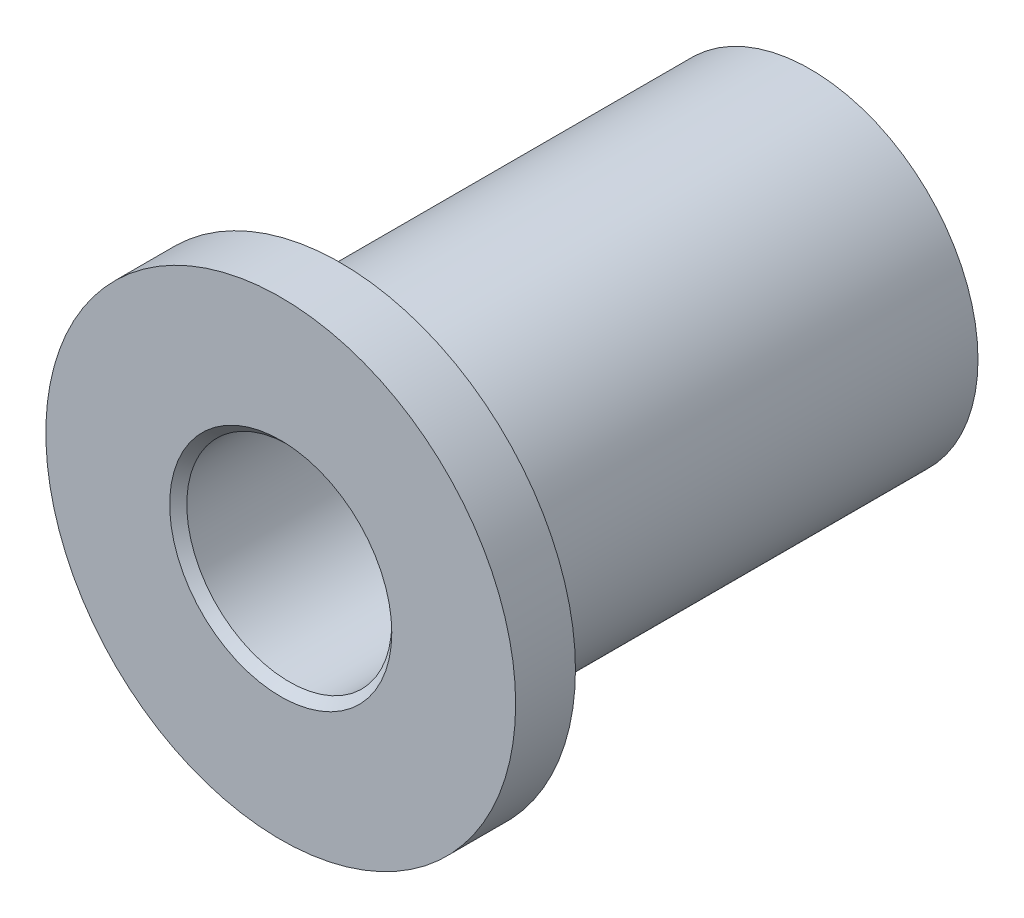
ISO-10303-21;
HEADER;
FILE_DESCRIPTION(('STEP AP214'),'2;1');
FILE_NAME('part.step','',(''),(''),'','','');
FILE_SCHEMA(('AUTOMOTIVE_DESIGN { 1 0 10303 214 1 1 1 1 }'));
ENDSEC;
DATA;
#1=APPLICATION_CONTEXT('core data for automotive mechanical design processes');
#2=APPLICATION_PROTOCOL_DEFINITION('international standard','automotive_design',2000,#1);
#3=PRODUCT_CONTEXT('',#1,'mechanical');
#4=PRODUCT('Part','Part','',(#3));
#5=PRODUCT_RELATED_PRODUCT_CATEGORY('part','',(#4));
#6=PRODUCT_DEFINITION_FORMATION('','',#4);
#7=PRODUCT_DEFINITION_CONTEXT('part definition',#1,'design');
#8=PRODUCT_DEFINITION('design','',#6,#7);
#9=PRODUCT_DEFINITION_SHAPE('','',#8);
#10=(LENGTH_UNIT() NAMED_UNIT(*) SI_UNIT(.MILLI.,.METRE.));
#11=(NAMED_UNIT(*) PLANE_ANGLE_UNIT() SI_UNIT($,.RADIAN.));
#12=(NAMED_UNIT(*) SI_UNIT($,.STERADIAN.) SOLID_ANGLE_UNIT());
#13=UNCERTAINTY_MEASURE_WITH_UNIT(LENGTH_MEASURE(1.E-05),#10,'distance_accuracy_value','');
#14=(GEOMETRIC_REPRESENTATION_CONTEXT(3) GLOBAL_UNCERTAINTY_ASSIGNED_CONTEXT((#13)) GLOBAL_UNIT_ASSIGNED_CONTEXT((#10,
#11,#12)) REPRESENTATION_CONTEXT('',''));
#15=CARTESIAN_POINT('',(0.,0.,0.));
#16=DIRECTION('',(0.,0.,1.));
#17=DIRECTION('',(1.,0.,0.));
#18=AXIS2_PLACEMENT_3D('',#15,#16,#17);
#19=CARTESIAN_POINT('',(0.,0.,-1.4));
#20=DIRECTION('',(0.,0.,1.));
#21=DIRECTION('',(1.,0.,0.));
#22=AXIS2_PLACEMENT_3D('',#19,#20,#21);
#23=PLANE('',#22);
#24=CARTESIAN_POINT('',(0.,0.,-1.4));
#25=DIRECTION('',(0.,0.,1.));
#26=DIRECTION('',(1.,0.,0.));
#27=AXIS2_PLACEMENT_3D('',#24,#25,#26);
#28=CIRCLE('',#27,5.5);
#29=CARTESIAN_POINT('',(5.5,0.,-1.4));
#30=VERTEX_POINT('',#29);
#31=EDGE_CURVE('E45',#30,#30,#28,.T.);
#32=ORIENTED_EDGE('',*,*,#31,.F.);
#33=EDGE_LOOP('',(#32));
#34=FACE_BOUND('',#33,.T.);
#35=CARTESIAN_POINT('',(0.,0.,-1.4));
#36=DIRECTION('',(0.,0.,1.));
#37=DIRECTION('',(1.,0.,0.));
#38=AXIS2_PLACEMENT_3D('',#35,#36,#37);
#39=CIRCLE('',#38,3.925);
#40=CARTESIAN_POINT('',(3.925,0.,-1.4));
#41=VERTEX_POINT('',#40);
#42=EDGE_CURVE('E41',#41,#41,#39,.F.);
#43=ORIENTED_EDGE('',*,*,#42,.F.);
#44=EDGE_LOOP('',(#43));
#45=FACE_BOUND('',#44,.T.);
#46=ADVANCED_FACE('F30',(#34,#45),#23,.F.);
#47=CARTESIAN_POINT('',(0.,0.,-1.4));
#48=DIRECTION('',(0.,0.,1.));
#49=DIRECTION('',(1.,0.,0.));
#50=AXIS2_PLACEMENT_3D('',#47,#48,#49);
#51=CYLINDRICAL_SURFACE('',#50,5.5);
#52=ORIENTED_EDGE('',*,*,#31,.T.);
#53=EDGE_LOOP('',(#52));
#54=FACE_BOUND('',#53,.T.);
#55=CARTESIAN_POINT('',(0.,0.,0.));
#56=DIRECTION('',(0.,0.,1.));
#57=DIRECTION('',(1.,0.,0.));
#58=AXIS2_PLACEMENT_3D('',#55,#56,#57);
#59=CIRCLE('',#58,5.5);
#60=CARTESIAN_POINT('',(5.5,0.,0.));
#61=VERTEX_POINT('',#60);
#62=EDGE_CURVE('E48',#61,#61,#59,.T.);
#63=ORIENTED_EDGE('',*,*,#62,.F.);
#64=EDGE_LOOP('',(#63));
#65=FACE_BOUND('',#64,.T.);
#66=ADVANCED_FACE('F74',(#54,#65),#51,.T.);
#67=CARTESIAN_POINT('',(0.,0.,0.));
#68=DIRECTION('',(0.,0.,1.));
#69=DIRECTION('',(1.,0.,0.));
#70=AXIS2_PLACEMENT_3D('',#67,#68,#69);
#71=PLANE('',#70);
#72=CARTESIAN_POINT('',(0.,0.,0.));
#73=DIRECTION('',(0.,0.,1.));
#74=DIRECTION('',(1.,0.,0.));
#75=AXIS2_PLACEMENT_3D('',#72,#73,#74);
#76=CIRCLE('',#75,2.60000000000001);
#77=CARTESIAN_POINT('',(2.60000000000001,0.,0.));
#78=VERTEX_POINT('',#77);
#79=EDGE_CURVE('E10',#78,#78,#76,.F.);
#80=ORIENTED_EDGE('',*,*,#79,.T.);
#81=EDGE_LOOP('',(#80));
#82=FACE_BOUND('',#81,.T.);
#83=ORIENTED_EDGE('',*,*,#62,.T.);
#84=EDGE_LOOP('',(#83));
#85=FACE_BOUND('',#84,.T.);
#86=ADVANCED_FACE('F80',(#82,#85),#71,.T.);
#87=CARTESIAN_POINT('',(0.,0.,-12.4));
#88=DIRECTION('',(0.,0.,1.));
#89=DIRECTION('',(1.,0.,0.));
#90=AXIS2_PLACEMENT_3D('',#87,#88,#89);
#91=CYLINDRICAL_SURFACE('',#90,3.925);
#92=CARTESIAN_POINT('',(0.,0.,-12.4));
#93=DIRECTION('',(0.,0.,-1.));
#94=DIRECTION('',(-1.,0.,0.));
#95=AXIS2_PLACEMENT_3D('',#92,#93,#94);
#96=CIRCLE('',#95,3.925);
#97=CARTESIAN_POINT('',(-3.925,0.,-12.4));
#98=VERTEX_POINT('',#97);
#99=EDGE_CURVE('E51',#98,#98,#96,.T.);
#100=ORIENTED_EDGE('',*,*,#99,.F.);
#101=EDGE_LOOP('',(#100));
#102=FACE_BOUND('',#101,.T.);
#103=ORIENTED_EDGE('',*,*,#42,.T.);
#104=EDGE_LOOP('',(#103));
#105=FACE_BOUND('',#104,.T.);
#106=ADVANCED_FACE('F71',(#102,#105),#91,.T.);
#107=CARTESIAN_POINT('',(0.,0.,-12.4));
#108=DIRECTION('',(0.,0.,-1.));
#109=DIRECTION('',(-1.,0.,0.));
#110=AXIS2_PLACEMENT_3D('',#107,#108,#109);
#111=PLANE('',#110);
#112=CARTESIAN_POINT('',(0.,0.,-12.4));
#113=DIRECTION('',(0.,0.,1.));
#114=DIRECTION('',(1.,0.,0.));
#115=AXIS2_PLACEMENT_3D('',#112,#113,#114);
#116=CIRCLE('',#115,2.4);
#117=CARTESIAN_POINT('',(2.4,0.,-12.4));
#118=VERTEX_POINT('',#117);
#119=EDGE_CURVE('E56',#118,#118,#116,.T.);
#120=ORIENTED_EDGE('',*,*,#119,.T.);
#121=EDGE_LOOP('',(#120));
#122=FACE_BOUND('',#121,.T.);
#123=ORIENTED_EDGE('',*,*,#99,.T.);
#124=EDGE_LOOP('',(#123));
#125=FACE_BOUND('',#124,.T.);
#126=ADVANCED_FACE('F60',(#122,#125),#111,.T.);
#127=CARTESIAN_POINT('',(0.,0.,-12.4));
#128=DIRECTION('',(0.,0.,1.));
#129=DIRECTION('',(1.,0.,0.));
#130=AXIS2_PLACEMENT_3D('',#127,#128,#129);
#131=CYLINDRICAL_SURFACE('',#130,2.4);
#132=CARTESIAN_POINT('',(0.,0.,-0.200000000000013));
#133=DIRECTION('',(0.,0.,1.));
#134=DIRECTION('',(1.,0.,0.));
#135=AXIS2_PLACEMENT_3D('',#132,#133,#134);
#136=CIRCLE('',#135,2.4);
#137=CARTESIAN_POINT('',(2.4,0.,-0.200000000000013));
#138=VERTEX_POINT('',#137);
#139=EDGE_CURVE('E37',#138,#138,#136,.T.);
#140=CARTESIAN_POINT('',(2.4,0.,-0.200000000000013));
#141=CARTESIAN_POINT('',(2.4,0.,-0.327083333333346));
#142=CARTESIAN_POINT('',(2.4,0.,-0.454166666666679));
#143=CARTESIAN_POINT('',(2.4,0.,-0.708333333333345));
#144=CARTESIAN_POINT('',(2.4,0.,-0.835416666666679));
#145=CARTESIAN_POINT('',(2.4,0.,-1.08958333333335));
#146=CARTESIAN_POINT('',(2.4,0.,-1.21666666666668));
#147=CARTESIAN_POINT('',(2.4,0.,-1.47083333333334));
#148=CARTESIAN_POINT('',(2.4,0.,-1.59791666666668));
#149=CARTESIAN_POINT('',(2.4,0.,-1.85208333333334));
#150=CARTESIAN_POINT('',(2.4,0.,-1.97916666666668));
#151=CARTESIAN_POINT('',(2.4,0.,-2.23333333333334));
#152=CARTESIAN_POINT('',(2.4,0.,-2.36041666666668));
#153=CARTESIAN_POINT('',(2.4,0.,-2.61458333333334));
#154=CARTESIAN_POINT('',(2.4,0.,-2.74166666666668));
#155=CARTESIAN_POINT('',(2.4,0.,-2.99583333333334));
#156=CARTESIAN_POINT('',(2.4,0.,-3.12291666666668));
#157=CARTESIAN_POINT('',(2.4,0.,-3.37708333333334));
#158=CARTESIAN_POINT('',(2.4,0.,-3.50416666666668));
#159=CARTESIAN_POINT('',(2.4,0.,-3.75833333333334));
#160=CARTESIAN_POINT('',(2.4,0.,-3.88541666666668));
#161=CARTESIAN_POINT('',(2.4,0.,-4.13958333333334));
#162=CARTESIAN_POINT('',(2.4,0.,-4.26666666666668));
#163=CARTESIAN_POINT('',(2.4,0.,-4.52083333333334));
#164=CARTESIAN_POINT('',(2.4,0.,-4.64791666666667));
#165=CARTESIAN_POINT('',(2.4,0.,-4.90208333333334));
#166=CARTESIAN_POINT('',(2.4,0.,-5.02916666666667));
#167=CARTESIAN_POINT('',(2.4,0.,-5.28333333333334));
#168=CARTESIAN_POINT('',(2.4,0.,-5.41041666666667));
#169=CARTESIAN_POINT('',(2.4,0.,-5.66458333333334));
#170=CARTESIAN_POINT('',(2.4,0.,-5.79166666666667));
#171=CARTESIAN_POINT('',(2.4,0.,-6.04583333333334));
#172=CARTESIAN_POINT('',(2.4,0.,-6.17291666666667));
#173=CARTESIAN_POINT('',(2.4,0.,-6.42708333333334));
#174=CARTESIAN_POINT('',(2.4,0.,-6.55416666666667));
#175=CARTESIAN_POINT('',(2.4,0.,-6.80833333333334));
#176=CARTESIAN_POINT('',(2.4,0.,-6.93541666666667));
#177=CARTESIAN_POINT('',(2.4,0.,-7.18958333333334));
#178=CARTESIAN_POINT('',(2.4,0.,-7.31666666666667));
#179=CARTESIAN_POINT('',(2.4,0.,-7.57083333333334));
#180=CARTESIAN_POINT('',(2.4,0.,-7.69791666666667));
#181=CARTESIAN_POINT('',(2.4,0.,-7.95208333333334));
#182=CARTESIAN_POINT('',(2.4,0.,-8.07916666666667));
#183=CARTESIAN_POINT('',(2.4,0.,-8.33333333333334));
#184=CARTESIAN_POINT('',(2.4,0.,-8.46041666666667));
#185=CARTESIAN_POINT('',(2.4,0.,-8.71458333333334));
#186=CARTESIAN_POINT('',(2.4,0.,-8.84166666666667));
#187=CARTESIAN_POINT('',(2.4,0.,-9.09583333333334));
#188=CARTESIAN_POINT('',(2.4,0.,-9.22291666666667));
#189=CARTESIAN_POINT('',(2.4,0.,-9.47708333333334));
#190=CARTESIAN_POINT('',(2.4,0.,-9.60416666666667));
#191=CARTESIAN_POINT('',(2.4,0.,-9.85833333333334));
#192=CARTESIAN_POINT('',(2.4,0.,-9.98541666666667));
#193=CARTESIAN_POINT('',(2.4,0.,-10.2395833333333));
#194=CARTESIAN_POINT('',(2.4,0.,-10.3666666666667));
#195=CARTESIAN_POINT('',(2.4,0.,-10.6208333333333));
#196=CARTESIAN_POINT('',(2.4,0.,-10.7479166666667));
#197=CARTESIAN_POINT('',(2.4,0.,-11.0020833333333));
#198=CARTESIAN_POINT('',(2.4,0.,-11.1291666666667));
#199=CARTESIAN_POINT('',(2.4,0.,-11.3833333333333));
#200=CARTESIAN_POINT('',(2.4,0.,-11.5104166666667));
#201=CARTESIAN_POINT('',(2.4,0.,-11.7645833333333));
#202=CARTESIAN_POINT('',(2.4,0.,-11.8916666666667));
#203=CARTESIAN_POINT('',(2.4,0.,-12.1458333333333));
#204=CARTESIAN_POINT('',(2.4,0.,-12.2729166666667));
#205=CARTESIAN_POINT('',(2.4,0.,-12.4));
#206=B_SPLINE_CURVE_WITH_KNOTS('',3,(#140,#141,#142,#143,#144,#145,#146,#147,#148,#149,#150,
#151,#152,#153,#154,#155,#156,#157,#158,#159,#160,#161,#162,#163,#164,#165,#166,#167,#168,#169,
#170,#171,#172,#173,#174,#175,#176,#177,#178,#179,#180,#181,#182,#183,#184,#185,#186,#187,#188,
#189,#190,#191,#192,#193,#194,#195,#196,#197,#198,#199,#200,#201,#202,#203,#204,#205),
.UNSPECIFIED.,.F.,.F.,(4,2,2,2,2,2,2,2,2,2,2,2,2,2,2,2,2,2,2,2,2,2,2,2,2,2,2,2,2,2,2,2,4),(0.,
0.38125,0.762499999999999,1.14375,1.525,1.90625,2.2875,2.66875,3.05,3.43125,3.8125,4.19375,
4.57499999999999,4.95624999999999,5.33749999999999,5.71874999999999,6.09999999999999,
6.48124999999999,6.86249999999999,7.24374999999999,7.62499999999999,8.00624999999999,
8.38749999999999,8.76874999999999,9.14999999999999,9.53124999999999,9.91249999999999,10.29375,
10.675,11.05625,11.4375,11.81875,12.2),.UNSPECIFIED.);
#207=EDGE_CURVE('BSEAM63',#138,#118,#206,.T.);
#208=ORIENTED_EDGE('',*,*,#139,.T.);
#209=ORIENTED_EDGE('',*,*,#119,.F.);
#210=ORIENTED_EDGE('',*,*,#207,.T.);
#211=ORIENTED_EDGE('',*,*,#207,.F.);
#212=EDGE_LOOP('',(#208,#210,#209,#211));
#213=FACE_BOUND('',#212,.T.);
#214=ADVANCED_FACE('F63',(#213),#131,.F.);
#215=CARTESIAN_POINT('',(0.,0.,-0.200000000000013));
#216=DIRECTION('',(0.,0.,1.));
#217=DIRECTION('',(1.,0.,0.));
#218=AXIS2_PLACEMENT_3D('',#215,#216,#217);
#219=CONICAL_SURFACE('',#218,2.4,0.78539816339745);
#220=ORIENTED_EDGE('',*,*,#79,.F.);
#221=EDGE_LOOP('',(#220));
#222=FACE_BOUND('',#221,.T.);
#223=ORIENTED_EDGE('',*,*,#139,.F.);
#224=EDGE_LOOP('',(#223));
#225=FACE_BOUND('',#224,.T.);
#226=ADVANCED_FACE('F32',(#222,#225),#219,.F.);
#227=CLOSED_SHELL('',(#46,#66,#86,#106,#126,#214,#226));
#228=MANIFOLD_SOLID_BREP('B2',#227);
#229=ADVANCED_BREP_SHAPE_REPRESENTATION('',(#18,#228),#14);
#230=SHAPE_DEFINITION_REPRESENTATION(#9,#229);
ENDSEC;
END-ISO-10303-21;
